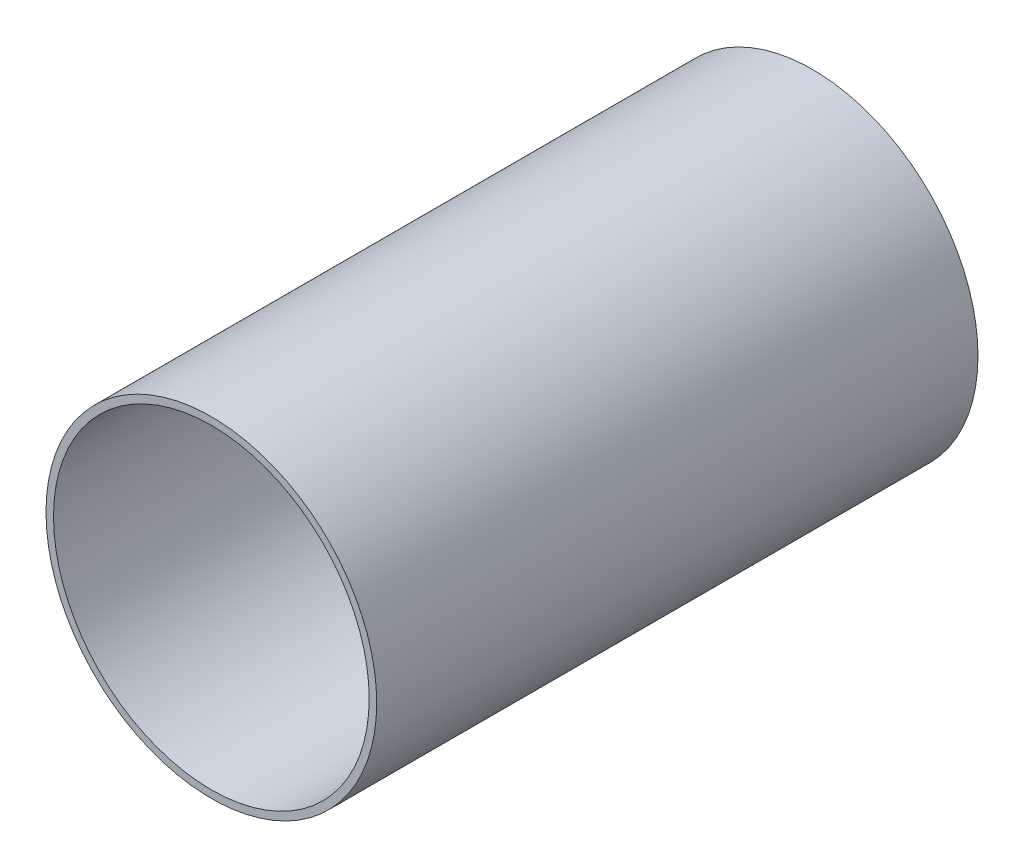
ISO-10303-21;
HEADER;
FILE_DESCRIPTION(('STEP AP214'),'2;1');
FILE_NAME('part.step','',(''),(''),'','','');
FILE_SCHEMA(('AUTOMOTIVE_DESIGN { 1 0 10303 214 1 1 1 1 }'));
ENDSEC;
DATA;
#1=APPLICATION_CONTEXT('core data for automotive mechanical design processes');
#2=APPLICATION_PROTOCOL_DEFINITION('international standard','automotive_design',2000,#1);
#3=PRODUCT_CONTEXT('',#1,'mechanical');
#4=PRODUCT('Part','Part','',(#3));
#5=PRODUCT_RELATED_PRODUCT_CATEGORY('part','',(#4));
#6=PRODUCT_DEFINITION_FORMATION('','',#4);
#7=PRODUCT_DEFINITION_CONTEXT('part definition',#1,'design');
#8=PRODUCT_DEFINITION('design','',#6,#7);
#9=PRODUCT_DEFINITION_SHAPE('','',#8);
#10=(LENGTH_UNIT() NAMED_UNIT(*) SI_UNIT(.MILLI.,.METRE.));
#11=(NAMED_UNIT(*) PLANE_ANGLE_UNIT() SI_UNIT($,.RADIAN.));
#12=(NAMED_UNIT(*) SI_UNIT($,.STERADIAN.) SOLID_ANGLE_UNIT());
#13=UNCERTAINTY_MEASURE_WITH_UNIT(LENGTH_MEASURE(1.E-05),#10,'distance_accuracy_value','');
#14=(GEOMETRIC_REPRESENTATION_CONTEXT(3) GLOBAL_UNCERTAINTY_ASSIGNED_CONTEXT((#13)) GLOBAL_UNIT_ASSIGNED_CONTEXT((#10,
#11,#12)) REPRESENTATION_CONTEXT('',''));
#15=CARTESIAN_POINT('',(0.,0.,0.));
#16=DIRECTION('',(0.,0.,1.));
#17=DIRECTION('',(1.,0.,0.));
#18=AXIS2_PLACEMENT_3D('',#15,#16,#17);
#19=CARTESIAN_POINT('',(0.,0.,200.));
#20=DIRECTION('',(0.,0.,1.));
#21=DIRECTION('',(1.,0.,0.));
#22=AXIS2_PLACEMENT_3D('',#19,#20,#21);
#23=PLANE('',#22);
#24=CARTESIAN_POINT('',(0.,0.,200.));
#25=DIRECTION('',(0.,0.,1.));
#26=DIRECTION('',(1.,0.,0.));
#27=AXIS2_PLACEMENT_3D('',#24,#25,#26);
#28=CIRCLE('',#27,55.);
#29=CARTESIAN_POINT('',(55.,0.,200.));
#30=VERTEX_POINT('',#29);
#31=EDGE_CURVE('E10',#30,#30,#28,.T.);
#32=ORIENTED_EDGE('',*,*,#31,.T.);
#33=EDGE_LOOP('',(#32));
#34=FACE_BOUND('',#33,.T.);
#35=CARTESIAN_POINT('',(0.,0.,200.));
#36=DIRECTION('',(0.,0.,1.));
#37=DIRECTION('',(1.,0.,0.));
#38=AXIS2_PLACEMENT_3D('',#35,#36,#37);
#39=CIRCLE('',#38,52.5);
#40=CARTESIAN_POINT('',(52.5,0.,200.));
#41=VERTEX_POINT('',#40);
#42=EDGE_CURVE('E52',#41,#41,#39,.T.);
#43=ORIENTED_EDGE('',*,*,#42,.F.);
#44=EDGE_LOOP('',(#43));
#45=FACE_BOUND('',#44,.T.);
#46=ADVANCED_FACE('F39',(#34,#45),#23,.T.);
#47=CARTESIAN_POINT('',(0.,0.,0.));
#48=DIRECTION('',(0.,0.,1.));
#49=DIRECTION('',(1.,0.,0.));
#50=AXIS2_PLACEMENT_3D('',#47,#48,#49);
#51=PLANE('',#50);
#52=CARTESIAN_POINT('',(0.,0.,0.));
#53=DIRECTION('',(0.,0.,1.));
#54=DIRECTION('',(1.,0.,0.));
#55=AXIS2_PLACEMENT_3D('',#52,#53,#54);
#56=CIRCLE('',#55,55.);
#57=CARTESIAN_POINT('',(55.,0.,0.));
#58=VERTEX_POINT('',#57);
#59=EDGE_CURVE('E43',#58,#58,#56,.T.);
#60=ORIENTED_EDGE('',*,*,#59,.F.);
#61=EDGE_LOOP('',(#60));
#62=FACE_BOUND('',#61,.T.);
#63=CARTESIAN_POINT('',(0.,0.,0.));
#64=DIRECTION('',(0.,0.,1.));
#65=DIRECTION('',(1.,0.,0.));
#66=AXIS2_PLACEMENT_3D('',#63,#64,#65);
#67=CIRCLE('',#66,52.5);
#68=CARTESIAN_POINT('',(52.5,0.,0.));
#69=VERTEX_POINT('',#68);
#70=EDGE_CURVE('E54',#69,#69,#67,.T.);
#71=ORIENTED_EDGE('',*,*,#70,.T.);
#72=EDGE_LOOP('',(#71));
#73=FACE_BOUND('',#72,.T.);
#74=ADVANCED_FACE('F66',(#62,#73),#51,.F.);
#75=CARTESIAN_POINT('',(0.,0.,200.));
#76=DIRECTION('',(0.,0.,-1.));
#77=DIRECTION('',(-1.,0.,0.));
#78=AXIS2_PLACEMENT_3D('',#75,#76,#77);
#79=CYLINDRICAL_SURFACE('',#78,55.);
#80=ORIENTED_EDGE('',*,*,#31,.F.);
#81=EDGE_LOOP('',(#80));
#82=FACE_BOUND('',#81,.T.);
#83=ORIENTED_EDGE('',*,*,#59,.T.);
#84=EDGE_LOOP('',(#83));
#85=FACE_BOUND('',#84,.T.);
#86=ADVANCED_FACE('F41',(#82,#85),#79,.T.);
#87=CARTESIAN_POINT('',(0.,0.,200.));
#88=DIRECTION('',(0.,0.,-1.));
#89=DIRECTION('',(-1.,0.,0.));
#90=AXIS2_PLACEMENT_3D('',#87,#88,#89);
#91=CYLINDRICAL_SURFACE('',#90,52.5);
#92=ORIENTED_EDGE('',*,*,#42,.T.);
#93=EDGE_LOOP('',(#92));
#94=FACE_BOUND('',#93,.T.);
#95=ORIENTED_EDGE('',*,*,#70,.F.);
#96=EDGE_LOOP('',(#95));
#97=FACE_BOUND('',#96,.T.);
#98=ADVANCED_FACE('F62',(#94,#97),#91,.F.);
#99=CLOSED_SHELL('',(#46,#74,#86,#98));
#100=MANIFOLD_SOLID_BREP('B2',#99);
#101=ADVANCED_BREP_SHAPE_REPRESENTATION('',(#18,#100),#14);
#102=SHAPE_DEFINITION_REPRESENTATION(#9,#101);
ENDSEC;
END-ISO-10303-21;
